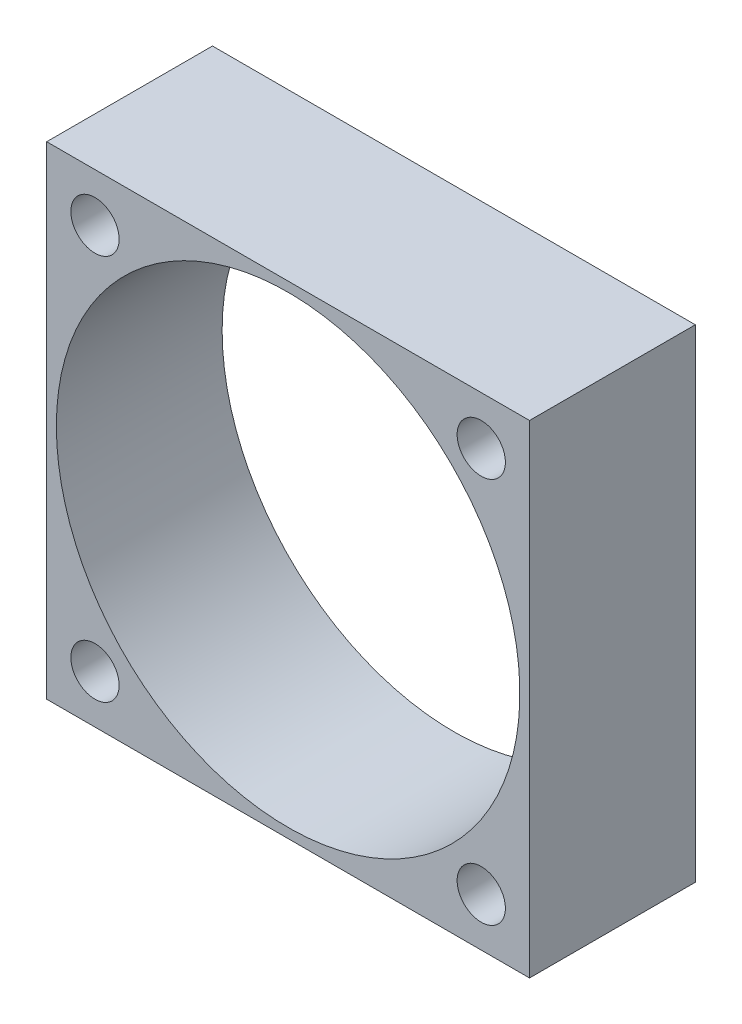
ISO-10303-21;
HEADER;
FILE_DESCRIPTION(('STEP AP214'),'2;1');
FILE_NAME('part.step','',(''),(''),'','','');
FILE_SCHEMA(('AUTOMOTIVE_DESIGN { 1 0 10303 214 1 1 1 1 }'));
ENDSEC;
DATA;
#1=APPLICATION_CONTEXT('core data for automotive mechanical design processes');
#2=APPLICATION_PROTOCOL_DEFINITION('international standard','automotive_design',2000,#1);
#3=PRODUCT_CONTEXT('',#1,'mechanical');
#4=PRODUCT('Part','Part','',(#3));
#5=PRODUCT_RELATED_PRODUCT_CATEGORY('part','',(#4));
#6=PRODUCT_DEFINITION_FORMATION('','',#4);
#7=PRODUCT_DEFINITION_CONTEXT('part definition',#1,'design');
#8=PRODUCT_DEFINITION('design','',#6,#7);
#9=PRODUCT_DEFINITION_SHAPE('','',#8);
#10=(LENGTH_UNIT() NAMED_UNIT(*) SI_UNIT(.MILLI.,.METRE.));
#11=(NAMED_UNIT(*) PLANE_ANGLE_UNIT() SI_UNIT($,.RADIAN.));
#12=(NAMED_UNIT(*) SI_UNIT($,.STERADIAN.) SOLID_ANGLE_UNIT());
#13=UNCERTAINTY_MEASURE_WITH_UNIT(LENGTH_MEASURE(1.E-05),#10,'distance_accuracy_value','');
#14=(GEOMETRIC_REPRESENTATION_CONTEXT(3) GLOBAL_UNCERTAINTY_ASSIGNED_CONTEXT((#13)) GLOBAL_UNIT_ASSIGNED_CONTEXT((#10,
#11,#12)) REPRESENTATION_CONTEXT('',''));
#15=CARTESIAN_POINT('',(0.,0.,0.));
#16=DIRECTION('',(0.,0.,1.));
#17=DIRECTION('',(1.,0.,0.));
#18=AXIS2_PLACEMENT_3D('',#15,#16,#17);
#19=CARTESIAN_POINT('',(0.,0.,10.3));
#20=DIRECTION('',(0.,0.,-1.));
#21=DIRECTION('',(-1.,0.,0.));
#22=AXIS2_PLACEMENT_3D('',#19,#20,#21);
#23=PLANE('',#22);
#24=DIRECTION('',(0.,1.,0.));
#25=VECTOR('',#24,1.);
#26=CARTESIAN_POINT('',(15.,-15.,10.3));
#27=LINE('',#26,#25);
#28=CARTESIAN_POINT('',(15.,-15.,10.3));
#29=VERTEX_POINT('',#28);
#30=CARTESIAN_POINT('',(15.,15.,10.3));
#31=VERTEX_POINT('',#30);
#32=EDGE_CURVE('E85',#29,#31,#27,.T.);
#33=ORIENTED_EDGE('',*,*,#32,.T.);
#34=DIRECTION('',(-1.,0.,0.));
#35=VECTOR('',#34,1.);
#36=CARTESIAN_POINT('',(-15.,15.,10.3));
#37=LINE('',#36,#35);
#38=CARTESIAN_POINT('',(-15.,15.,10.3));
#39=VERTEX_POINT('',#38);
#40=EDGE_CURVE('E80',#31,#39,#37,.T.);
#41=ORIENTED_EDGE('',*,*,#40,.T.);
#42=DIRECTION('',(0.,-1.,0.));
#43=VECTOR('',#42,1.);
#44=CARTESIAN_POINT('',(-15.,-15.,10.3));
#45=LINE('',#44,#43);
#46=CARTESIAN_POINT('',(-15.,-15.,10.3));
#47=VERTEX_POINT('',#46);
#48=EDGE_CURVE('E83',#39,#47,#45,.T.);
#49=ORIENTED_EDGE('',*,*,#48,.T.);
#50=DIRECTION('',(1.,0.,0.));
#51=VECTOR('',#50,1.);
#52=CARTESIAN_POINT('',(-15.,-15.,10.3));
#53=LINE('',#52,#51);
#54=EDGE_CURVE('E50',#47,#29,#53,.T.);
#55=ORIENTED_EDGE('',*,*,#54,.T.);
#56=EDGE_LOOP('',(#33,#41,#49,#55));
#57=FACE_BOUND('',#56,.T.);
#58=CARTESIAN_POINT('',(0.,0.,10.3));
#59=DIRECTION('',(0.,0.,1.));
#60=DIRECTION('',(1.,0.,0.));
#61=AXIS2_PLACEMENT_3D('',#58,#59,#60);
#62=CIRCLE('',#61,14.4);
#63=CARTESIAN_POINT('',(-14.4,0.,10.3));
#64=VERTEX_POINT('',#63);
#65=EDGE_CURVE('E100',#64,#64,#62,.T.);
#66=ORIENTED_EDGE('',*,*,#65,.F.);
#67=EDGE_LOOP('',(#66));
#68=FACE_BOUND('',#67,.T.);
#69=CARTESIAN_POINT('',(-12.,12.,10.3));
#70=DIRECTION('',(0.,0.,1.));
#71=DIRECTION('',(1.,0.,0.));
#72=AXIS2_PLACEMENT_3D('',#69,#70,#71);
#73=CIRCLE('',#72,1.5);
#74=CARTESIAN_POINT('',(-13.5,12.,10.3));
#75=VERTEX_POINT('',#74);
#76=EDGE_CURVE('E115',#75,#75,#73,.T.);
#77=ORIENTED_EDGE('',*,*,#76,.F.);
#78=EDGE_LOOP('',(#77));
#79=FACE_BOUND('',#78,.T.);
#80=CARTESIAN_POINT('',(12.,12.,10.3));
#81=DIRECTION('',(0.,0.,1.));
#82=DIRECTION('',(1.,0.,0.));
#83=AXIS2_PLACEMENT_3D('',#80,#81,#82);
#84=CIRCLE('',#83,1.5);
#85=CARTESIAN_POINT('',(10.5,12.,10.3));
#86=VERTEX_POINT('',#85);
#87=EDGE_CURVE('E121',#86,#86,#84,.T.);
#88=ORIENTED_EDGE('',*,*,#87,.F.);
#89=EDGE_LOOP('',(#88));
#90=FACE_BOUND('',#89,.T.);
#91=CARTESIAN_POINT('',(12.,-12.,10.3));
#92=DIRECTION('',(0.,0.,1.));
#93=DIRECTION('',(1.,0.,0.));
#94=AXIS2_PLACEMENT_3D('',#91,#92,#93);
#95=CIRCLE('',#94,1.5);
#96=CARTESIAN_POINT('',(10.5,-12.,10.3));
#97=VERTEX_POINT('',#96);
#98=EDGE_CURVE('E127',#97,#97,#95,.T.);
#99=ORIENTED_EDGE('',*,*,#98,.F.);
#100=EDGE_LOOP('',(#99));
#101=FACE_BOUND('',#100,.T.);
#102=CARTESIAN_POINT('',(-12.,-12.,10.3));
#103=DIRECTION('',(0.,0.,1.));
#104=DIRECTION('',(1.,0.,0.));
#105=AXIS2_PLACEMENT_3D('',#102,#103,#104);
#106=CIRCLE('',#105,1.5);
#107=CARTESIAN_POINT('',(-13.5,-12.,10.3));
#108=VERTEX_POINT('',#107);
#109=EDGE_CURVE('E133',#108,#108,#106,.T.);
#110=ORIENTED_EDGE('',*,*,#109,.F.);
#111=EDGE_LOOP('',(#110));
#112=FACE_BOUND('',#111,.T.);
#113=ADVANCED_FACE('F33',(#57,#68,#79,#90,#101,#112),#23,.F.);
#114=CARTESIAN_POINT('',(0.,0.,0.));
#115=DIRECTION('',(0.,0.,-1.));
#116=DIRECTION('',(-1.,0.,0.));
#117=AXIS2_PLACEMENT_3D('',#114,#115,#116);
#118=PLANE('',#117);
#119=CARTESIAN_POINT('',(12.,-12.,0.));
#120=DIRECTION('',(0.,0.,1.));
#121=DIRECTION('',(1.,0.,0.));
#122=AXIS2_PLACEMENT_3D('',#119,#120,#121);
#123=CIRCLE('',#122,1.5);
#124=CARTESIAN_POINT('',(10.5,-12.,0.));
#125=VERTEX_POINT('',#124);
#126=EDGE_CURVE('E130',#125,#125,#123,.T.);
#127=ORIENTED_EDGE('',*,*,#126,.T.);
#128=EDGE_LOOP('',(#127));
#129=FACE_BOUND('',#128,.T.);
#130=CARTESIAN_POINT('',(-12.,12.,0.));
#131=DIRECTION('',(0.,0.,1.));
#132=DIRECTION('',(1.,0.,0.));
#133=AXIS2_PLACEMENT_3D('',#130,#131,#132);
#134=CIRCLE('',#133,1.5);
#135=CARTESIAN_POINT('',(-13.5,12.,0.));
#136=VERTEX_POINT('',#135);
#137=EDGE_CURVE('E118',#136,#136,#134,.T.);
#138=ORIENTED_EDGE('',*,*,#137,.T.);
#139=EDGE_LOOP('',(#138));
#140=FACE_BOUND('',#139,.T.);
#141=DIRECTION('',(0.,1.,0.));
#142=VECTOR('',#141,1.);
#143=CARTESIAN_POINT('',(15.,-15.,0.));
#144=LINE('',#143,#142);
#145=CARTESIAN_POINT('',(15.,-15.,0.));
#146=VERTEX_POINT('',#145);
#147=CARTESIAN_POINT('',(15.,15.,0.));
#148=VERTEX_POINT('',#147);
#149=EDGE_CURVE('E97',#146,#148,#144,.T.);
#150=ORIENTED_EDGE('',*,*,#149,.F.);
#151=DIRECTION('',(1.,0.,0.));
#152=VECTOR('',#151,1.);
#153=CARTESIAN_POINT('',(-15.,-15.,0.));
#154=LINE('',#153,#152);
#155=CARTESIAN_POINT('',(-15.,-15.,0.));
#156=VERTEX_POINT('',#155);
#157=EDGE_CURVE('E73',#156,#146,#154,.T.);
#158=ORIENTED_EDGE('',*,*,#157,.F.);
#159=DIRECTION('',(0.,-1.,0.));
#160=VECTOR('',#159,1.);
#161=CARTESIAN_POINT('',(-15.,-15.,0.));
#162=LINE('',#161,#160);
#163=CARTESIAN_POINT('',(-15.,15.,0.));
#164=VERTEX_POINT('',#163);
#165=EDGE_CURVE('E67',#164,#156,#162,.T.);
#166=ORIENTED_EDGE('',*,*,#165,.F.);
#167=DIRECTION('',(-1.,0.,0.));
#168=VECTOR('',#167,1.);
#169=CARTESIAN_POINT('',(-15.,15.,0.));
#170=LINE('',#169,#168);
#171=EDGE_CURVE('E89',#148,#164,#170,.T.);
#172=ORIENTED_EDGE('',*,*,#171,.F.);
#173=EDGE_LOOP('',(#150,#158,#166,#172));
#174=FACE_BOUND('',#173,.T.);
#175=CARTESIAN_POINT('',(0.,0.,0.));
#176=DIRECTION('',(0.,0.,1.));
#177=DIRECTION('',(1.,0.,0.));
#178=AXIS2_PLACEMENT_3D('',#175,#176,#177);
#179=CIRCLE('',#178,14.4);
#180=CARTESIAN_POINT('',(-14.4,0.,0.));
#181=VERTEX_POINT('',#180);
#182=EDGE_CURVE('E112',#181,#181,#179,.T.);
#183=ORIENTED_EDGE('',*,*,#182,.T.);
#184=EDGE_LOOP('',(#183));
#185=FACE_BOUND('',#184,.T.);
#186=CARTESIAN_POINT('',(12.,12.,0.));
#187=DIRECTION('',(0.,0.,1.));
#188=DIRECTION('',(1.,0.,0.));
#189=AXIS2_PLACEMENT_3D('',#186,#187,#188);
#190=CIRCLE('',#189,1.5);
#191=CARTESIAN_POINT('',(10.5,12.,0.));
#192=VERTEX_POINT('',#191);
#193=EDGE_CURVE('E124',#192,#192,#190,.T.);
#194=ORIENTED_EDGE('',*,*,#193,.T.);
#195=EDGE_LOOP('',(#194));
#196=FACE_BOUND('',#195,.T.);
#197=CARTESIAN_POINT('',(-12.,-12.,0.));
#198=DIRECTION('',(0.,0.,1.));
#199=DIRECTION('',(1.,0.,0.));
#200=AXIS2_PLACEMENT_3D('',#197,#198,#199);
#201=CIRCLE('',#200,1.5);
#202=CARTESIAN_POINT('',(-13.5,-12.,0.));
#203=VERTEX_POINT('',#202);
#204=EDGE_CURVE('E136',#203,#203,#201,.T.);
#205=ORIENTED_EDGE('',*,*,#204,.T.);
#206=EDGE_LOOP('',(#205));
#207=FACE_BOUND('',#206,.T.);
#208=ADVANCED_FACE('F108',(#129,#140,#174,#185,#196,#207),#118,.T.);
#209=CARTESIAN_POINT('',(15.,-15.,10.3));
#210=DIRECTION('',(-1.,0.,0.));
#211=DIRECTION('',(0.,0.,1.));
#212=AXIS2_PLACEMENT_3D('',#209,#210,#211);
#213=PLANE('',#212);
#214=ORIENTED_EDGE('',*,*,#149,.T.);
#215=DIRECTION('',(0.,0.,-1.));
#216=VECTOR('',#215,1.);
#217=CARTESIAN_POINT('',(15.,15.,10.3));
#218=LINE('',#217,#216);
#219=EDGE_CURVE('E11',#31,#148,#218,.T.);
#220=ORIENTED_EDGE('',*,*,#219,.F.);
#221=ORIENTED_EDGE('',*,*,#32,.F.);
#222=DIRECTION('',(0.,0.,-1.));
#223=VECTOR('',#222,1.);
#224=CARTESIAN_POINT('',(15.,-15.,10.3));
#225=LINE('',#224,#223);
#226=EDGE_CURVE('E93',#29,#146,#225,.T.);
#227=ORIENTED_EDGE('',*,*,#226,.T.);
#228=EDGE_LOOP('',(#214,#220,#221,#227));
#229=FACE_BOUND('',#228,.T.);
#230=ADVANCED_FACE('F35',(#229),#213,.F.);
#231=CARTESIAN_POINT('',(-15.,15.,10.3));
#232=DIRECTION('',(0.,-1.,0.));
#233=DIRECTION('',(0.,0.,-1.));
#234=AXIS2_PLACEMENT_3D('',#231,#232,#233);
#235=PLANE('',#234);
#236=ORIENTED_EDGE('',*,*,#171,.T.);
#237=DIRECTION('',(0.,0.,-1.));
#238=VECTOR('',#237,1.);
#239=CARTESIAN_POINT('',(-15.,15.,10.3));
#240=LINE('',#239,#238);
#241=EDGE_CURVE('E42',#39,#164,#240,.T.);
#242=ORIENTED_EDGE('',*,*,#241,.F.);
#243=ORIENTED_EDGE('',*,*,#40,.F.);
#244=ORIENTED_EDGE('',*,*,#219,.T.);
#245=EDGE_LOOP('',(#236,#242,#243,#244));
#246=FACE_BOUND('',#245,.T.);
#247=ADVANCED_FACE('F88',(#246),#235,.F.);
#248=CARTESIAN_POINT('',(-15.,-15.,10.3));
#249=DIRECTION('',(1.,0.,0.));
#250=DIRECTION('',(0.,0.,-1.));
#251=AXIS2_PLACEMENT_3D('',#248,#249,#250);
#252=PLANE('',#251);
#253=ORIENTED_EDGE('',*,*,#165,.T.);
#254=DIRECTION('',(0.,0.,-1.));
#255=VECTOR('',#254,1.);
#256=CARTESIAN_POINT('',(-15.,-15.,10.3));
#257=LINE('',#256,#255);
#258=EDGE_CURVE('E90',#47,#156,#257,.T.);
#259=ORIENTED_EDGE('',*,*,#258,.F.);
#260=ORIENTED_EDGE('',*,*,#48,.F.);
#261=ORIENTED_EDGE('',*,*,#241,.T.);
#262=EDGE_LOOP('',(#253,#259,#260,#261));
#263=FACE_BOUND('',#262,.T.);
#264=ADVANCED_FACE('F91',(#263),#252,.F.);
#265=CARTESIAN_POINT('',(-15.,-15.,10.3));
#266=DIRECTION('',(0.,1.,0.));
#267=DIRECTION('',(0.,0.,1.));
#268=AXIS2_PLACEMENT_3D('',#265,#266,#267);
#269=PLANE('',#268);
#270=ORIENTED_EDGE('',*,*,#157,.T.);
#271=ORIENTED_EDGE('',*,*,#226,.F.);
#272=ORIENTED_EDGE('',*,*,#54,.F.);
#273=ORIENTED_EDGE('',*,*,#258,.T.);
#274=EDGE_LOOP('',(#270,#271,#272,#273));
#275=FACE_BOUND('',#274,.T.);
#276=ADVANCED_FACE('F105',(#275),#269,.F.);
#277=CARTESIAN_POINT('',(0.,0.,10.3));
#278=DIRECTION('',(0.,0.,-1.));
#279=DIRECTION('',(-1.,0.,0.));
#280=AXIS2_PLACEMENT_3D('',#277,#278,#279);
#281=CYLINDRICAL_SURFACE('',#280,14.4);
#282=CARTESIAN_POINT('',(-14.4,0.,10.3));
#283=CARTESIAN_POINT('',(-14.4,0.,10.1927083333333));
#284=CARTESIAN_POINT('',(-14.4,0.,10.0854166666667));
#285=CARTESIAN_POINT('',(-14.4,0.,9.87083333333333));
#286=CARTESIAN_POINT('',(-14.4,0.,9.76354166666667));
#287=CARTESIAN_POINT('',(-14.4,0.,9.54895833333333));
#288=CARTESIAN_POINT('',(-14.4,0.,9.44166666666667));
#289=CARTESIAN_POINT('',(-14.4,0.,9.22708333333333));
#290=CARTESIAN_POINT('',(-14.4,0.,9.11979166666667));
#291=CARTESIAN_POINT('',(-14.4,0.,8.90520833333333));
#292=CARTESIAN_POINT('',(-14.4,0.,8.79791666666667));
#293=CARTESIAN_POINT('',(-14.4,0.,8.58333333333333));
#294=CARTESIAN_POINT('',(-14.4,0.,8.47604166666667));
#295=CARTESIAN_POINT('',(-14.4,0.,8.26145833333333));
#296=CARTESIAN_POINT('',(-14.4,0.,8.15416666666667));
#297=CARTESIAN_POINT('',(-14.4,0.,7.93958333333333));
#298=CARTESIAN_POINT('',(-14.4,0.,7.83229166666667));
#299=CARTESIAN_POINT('',(-14.4,0.,7.61770833333333));
#300=CARTESIAN_POINT('',(-14.4,0.,7.51041666666667));
#301=CARTESIAN_POINT('',(-14.4,0.,7.29583333333333));
#302=CARTESIAN_POINT('',(-14.4,0.,7.18854166666667));
#303=CARTESIAN_POINT('',(-14.4,0.,6.97395833333333));
#304=CARTESIAN_POINT('',(-14.4,0.,6.86666666666667));
#305=CARTESIAN_POINT('',(-14.4,0.,6.65208333333333));
#306=CARTESIAN_POINT('',(-14.4,0.,6.54479166666667));
#307=CARTESIAN_POINT('',(-14.4,0.,6.33020833333333));
#308=CARTESIAN_POINT('',(-14.4,0.,6.22291666666667));
#309=CARTESIAN_POINT('',(-14.4,0.,6.00833333333333));
#310=CARTESIAN_POINT('',(-14.4,0.,5.90104166666667));
#311=CARTESIAN_POINT('',(-14.4,0.,5.68645833333333));
#312=CARTESIAN_POINT('',(-14.4,0.,5.57916666666667));
#313=CARTESIAN_POINT('',(-14.4,0.,5.36458333333333));
#314=CARTESIAN_POINT('',(-14.4,0.,5.25729166666667));
#315=CARTESIAN_POINT('',(-14.4,0.,5.04270833333333));
#316=CARTESIAN_POINT('',(-14.4,0.,4.93541666666667));
#317=CARTESIAN_POINT('',(-14.4,0.,4.72083333333333));
#318=CARTESIAN_POINT('',(-14.4,0.,4.61354166666667));
#319=CARTESIAN_POINT('',(-14.4,0.,4.39895833333333));
#320=CARTESIAN_POINT('',(-14.4,0.,4.29166666666667));
#321=CARTESIAN_POINT('',(-14.4,0.,4.07708333333333));
#322=CARTESIAN_POINT('',(-14.4,0.,3.96979166666667));
#323=CARTESIAN_POINT('',(-14.4,0.,3.75520833333333));
#324=CARTESIAN_POINT('',(-14.4,0.,3.64791666666667));
#325=CARTESIAN_POINT('',(-14.4,0.,3.43333333333333));
#326=CARTESIAN_POINT('',(-14.4,0.,3.32604166666667));
#327=CARTESIAN_POINT('',(-14.4,0.,3.11145833333333));
#328=CARTESIAN_POINT('',(-14.4,0.,3.00416666666667));
#329=CARTESIAN_POINT('',(-14.4,0.,2.78958333333333));
#330=CARTESIAN_POINT('',(-14.4,0.,2.68229166666667));
#331=CARTESIAN_POINT('',(-14.4,0.,2.46770833333333));
#332=CARTESIAN_POINT('',(-14.4,0.,2.36041666666667));
#333=CARTESIAN_POINT('',(-14.4,0.,2.14583333333333));
#334=CARTESIAN_POINT('',(-14.4,0.,2.03854166666667));
#335=CARTESIAN_POINT('',(-14.4,0.,1.82395833333333));
#336=CARTESIAN_POINT('',(-14.4,0.,1.71666666666667));
#337=CARTESIAN_POINT('',(-14.4,0.,1.50208333333333));
#338=CARTESIAN_POINT('',(-14.4,0.,1.39479166666667));
#339=CARTESIAN_POINT('',(-14.4,0.,1.18020833333333));
#340=CARTESIAN_POINT('',(-14.4,0.,1.07291666666666));
#341=CARTESIAN_POINT('',(-14.4,0.,0.858333333333331));
#342=CARTESIAN_POINT('',(-14.4,0.,0.751041666666665));
#343=CARTESIAN_POINT('',(-14.4,0.,0.536458333333331));
#344=CARTESIAN_POINT('',(-14.4,0.,0.429166666666664));
#345=CARTESIAN_POINT('',(-14.4,0.,0.214583333333331));
#346=CARTESIAN_POINT('',(-14.4,0.,0.107291666666665));
#347=CARTESIAN_POINT('',(-14.4,0.,0.));
#348=B_SPLINE_CURVE_WITH_KNOTS('',3,(#282,#283,#284,#285,#286,#287,#288,#289,#290,#291,#292,
#293,#294,#295,#296,#297,#298,#299,#300,#301,#302,#303,#304,#305,#306,#307,#308,#309,#310,#311,
#312,#313,#314,#315,#316,#317,#318,#319,#320,#321,#322,#323,#324,#325,#326,#327,#328,#329,#330,
#331,#332,#333,#334,#335,#336,#337,#338,#339,#340,#341,#342,#343,#344,#345,#346,#347),
.UNSPECIFIED.,.F.,.F.,(4,2,2,2,2,2,2,2,2,2,2,2,2,2,2,2,2,2,2,2,2,2,2,2,2,2,2,2,2,2,2,2,4),(0.,
0.321874999999999,0.643749999999998,0.965625,1.2875,1.609375,1.93125,2.253125,2.575,2.896875,
3.21875,3.540625,3.8625,4.184375,4.50625,4.828125,5.15,5.471875,5.79375,6.115625,6.4375,
6.759375,7.08125,7.403125,7.725,8.046875,8.36875,8.690625,9.0125,9.334375,9.65625,9.978125,
10.3),.UNSPECIFIED.);
#349=EDGE_CURVE('BSEAM153',#64,#181,#348,.T.);
#350=ORIENTED_EDGE('',*,*,#65,.T.);
#351=ORIENTED_EDGE('',*,*,#182,.F.);
#352=ORIENTED_EDGE('',*,*,#349,.T.);
#353=ORIENTED_EDGE('',*,*,#349,.F.);
#354=EDGE_LOOP('',(#350,#352,#351,#353));
#355=FACE_BOUND('',#354,.T.);
#356=ADVANCED_FACE('F153',(#355),#281,.F.);
#357=CARTESIAN_POINT('',(-12.,12.,10.3));
#358=DIRECTION('',(0.,0.,-1.));
#359=DIRECTION('',(-1.,0.,0.));
#360=AXIS2_PLACEMENT_3D('',#357,#358,#359);
#361=CYLINDRICAL_SURFACE('',#360,1.5);
#362=CARTESIAN_POINT('',(-13.5,12.,10.3));
#363=CARTESIAN_POINT('',(-13.5,12.,10.1927083333333));
#364=CARTESIAN_POINT('',(-13.5,12.,10.0854166666667));
#365=CARTESIAN_POINT('',(-13.5,12.,9.87083333333333));
#366=CARTESIAN_POINT('',(-13.5,12.,9.76354166666667));
#367=CARTESIAN_POINT('',(-13.5,12.,9.54895833333333));
#368=CARTESIAN_POINT('',(-13.5,12.,9.44166666666667));
#369=CARTESIAN_POINT('',(-13.5,12.,9.22708333333333));
#370=CARTESIAN_POINT('',(-13.5,12.,9.11979166666667));
#371=CARTESIAN_POINT('',(-13.5,12.,8.90520833333333));
#372=CARTESIAN_POINT('',(-13.5,12.,8.79791666666667));
#373=CARTESIAN_POINT('',(-13.5,12.,8.58333333333333));
#374=CARTESIAN_POINT('',(-13.5,12.,8.47604166666667));
#375=CARTESIAN_POINT('',(-13.5,12.,8.26145833333333));
#376=CARTESIAN_POINT('',(-13.5,12.,8.15416666666667));
#377=CARTESIAN_POINT('',(-13.5,12.,7.93958333333333));
#378=CARTESIAN_POINT('',(-13.5,12.,7.83229166666667));
#379=CARTESIAN_POINT('',(-13.5,12.,7.61770833333333));
#380=CARTESIAN_POINT('',(-13.5,12.,7.51041666666667));
#381=CARTESIAN_POINT('',(-13.5,12.,7.29583333333333));
#382=CARTESIAN_POINT('',(-13.5,12.,7.18854166666667));
#383=CARTESIAN_POINT('',(-13.5,12.,6.97395833333333));
#384=CARTESIAN_POINT('',(-13.5,12.,6.86666666666667));
#385=CARTESIAN_POINT('',(-13.5,12.,6.65208333333333));
#386=CARTESIAN_POINT('',(-13.5,12.,6.54479166666667));
#387=CARTESIAN_POINT('',(-13.5,12.,6.33020833333333));
#388=CARTESIAN_POINT('',(-13.5,12.,6.22291666666667));
#389=CARTESIAN_POINT('',(-13.5,12.,6.00833333333333));
#390=CARTESIAN_POINT('',(-13.5,12.,5.90104166666667));
#391=CARTESIAN_POINT('',(-13.5,12.,5.68645833333333));
#392=CARTESIAN_POINT('',(-13.5,12.,5.57916666666667));
#393=CARTESIAN_POINT('',(-13.5,12.,5.36458333333333));
#394=CARTESIAN_POINT('',(-13.5,12.,5.25729166666667));
#395=CARTESIAN_POINT('',(-13.5,12.,5.04270833333333));
#396=CARTESIAN_POINT('',(-13.5,12.,4.93541666666667));
#397=CARTESIAN_POINT('',(-13.5,12.,4.72083333333333));
#398=CARTESIAN_POINT('',(-13.5,12.,4.61354166666667));
#399=CARTESIAN_POINT('',(-13.5,12.,4.39895833333333));
#400=CARTESIAN_POINT('',(-13.5,12.,4.29166666666667));
#401=CARTESIAN_POINT('',(-13.5,12.,4.07708333333333));
#402=CARTESIAN_POINT('',(-13.5,12.,3.96979166666667));
#403=CARTESIAN_POINT('',(-13.5,12.,3.75520833333333));
#404=CARTESIAN_POINT('',(-13.5,12.,3.64791666666667));
#405=CARTESIAN_POINT('',(-13.5,12.,3.43333333333333));
#406=CARTESIAN_POINT('',(-13.5,12.,3.32604166666667));
#407=CARTESIAN_POINT('',(-13.5,12.,3.11145833333333));
#408=CARTESIAN_POINT('',(-13.5,12.,3.00416666666667));
#409=CARTESIAN_POINT('',(-13.5,12.,2.78958333333333));
#410=CARTESIAN_POINT('',(-13.5,12.,2.68229166666667));
#411=CARTESIAN_POINT('',(-13.5,12.,2.46770833333333));
#412=CARTESIAN_POINT('',(-13.5,12.,2.36041666666667));
#413=CARTESIAN_POINT('',(-13.5,12.,2.14583333333333));
#414=CARTESIAN_POINT('',(-13.5,12.,2.03854166666667));
#415=CARTESIAN_POINT('',(-13.5,12.,1.82395833333333));
#416=CARTESIAN_POINT('',(-13.5,12.,1.71666666666667));
#417=CARTESIAN_POINT('',(-13.5,12.,1.50208333333333));
#418=CARTESIAN_POINT('',(-13.5,12.,1.39479166666667));
#419=CARTESIAN_POINT('',(-13.5,12.,1.18020833333333));
#420=CARTESIAN_POINT('',(-13.5,12.,1.07291666666666));
#421=CARTESIAN_POINT('',(-13.5,12.,0.858333333333331));
#422=CARTESIAN_POINT('',(-13.5,12.,0.751041666666665));
#423=CARTESIAN_POINT('',(-13.5,12.,0.536458333333331));
#424=CARTESIAN_POINT('',(-13.5,12.,0.429166666666664));
#425=CARTESIAN_POINT('',(-13.5,12.,0.214583333333331));
#426=CARTESIAN_POINT('',(-13.5,12.,0.107291666666665));
#427=CARTESIAN_POINT('',(-13.5,12.,0.));
#428=B_SPLINE_CURVE_WITH_KNOTS('',3,(#362,#363,#364,#365,#366,#367,#368,#369,#370,#371,#372,
#373,#374,#375,#376,#377,#378,#379,#380,#381,#382,#383,#384,#385,#386,#387,#388,#389,#390,#391,
#392,#393,#394,#395,#396,#397,#398,#399,#400,#401,#402,#403,#404,#405,#406,#407,#408,#409,#410,
#411,#412,#413,#414,#415,#416,#417,#418,#419,#420,#421,#422,#423,#424,#425,#426,#427),
.UNSPECIFIED.,.F.,.F.,(4,2,2,2,2,2,2,2,2,2,2,2,2,2,2,2,2,2,2,2,2,2,2,2,2,2,2,2,2,2,2,2,4),(0.,
0.321874999999999,0.643749999999998,0.965625,1.2875,1.609375,1.93125,2.253125,2.575,2.896875,
3.21875,3.540625,3.8625,4.184375,4.50625,4.828125,5.15,5.471875,5.79375,6.115625,6.4375,
6.759375,7.08125,7.403125,7.725,8.046875,8.36875,8.690625,9.0125,9.334375,9.65625,9.978125,
10.3),.UNSPECIFIED.);
#429=EDGE_CURVE('BSEAM199',#75,#136,#428,.T.);
#430=ORIENTED_EDGE('',*,*,#76,.T.);
#431=ORIENTED_EDGE('',*,*,#137,.F.);
#432=ORIENTED_EDGE('',*,*,#429,.T.);
#433=ORIENTED_EDGE('',*,*,#429,.F.);
#434=EDGE_LOOP('',(#430,#432,#431,#433));
#435=FACE_BOUND('',#434,.T.);
#436=ADVANCED_FACE('F199',(#435),#361,.F.);
#437=CARTESIAN_POINT('',(12.,12.,10.3));
#438=DIRECTION('',(0.,0.,-1.));
#439=DIRECTION('',(-1.,0.,0.));
#440=AXIS2_PLACEMENT_3D('',#437,#438,#439);
#441=CYLINDRICAL_SURFACE('',#440,1.5);
#442=CARTESIAN_POINT('',(10.5,12.,10.3));
#443=CARTESIAN_POINT('',(10.5,12.,10.1927083333333));
#444=CARTESIAN_POINT('',(10.5,12.,10.0854166666667));
#445=CARTESIAN_POINT('',(10.5,12.,9.87083333333333));
#446=CARTESIAN_POINT('',(10.5,12.,9.76354166666667));
#447=CARTESIAN_POINT('',(10.5,12.,9.54895833333333));
#448=CARTESIAN_POINT('',(10.5,12.,9.44166666666667));
#449=CARTESIAN_POINT('',(10.5,12.,9.22708333333333));
#450=CARTESIAN_POINT('',(10.5,12.,9.11979166666667));
#451=CARTESIAN_POINT('',(10.5,12.,8.90520833333333));
#452=CARTESIAN_POINT('',(10.5,12.,8.79791666666667));
#453=CARTESIAN_POINT('',(10.5,12.,8.58333333333333));
#454=CARTESIAN_POINT('',(10.5,12.,8.47604166666667));
#455=CARTESIAN_POINT('',(10.5,12.,8.26145833333333));
#456=CARTESIAN_POINT('',(10.5,12.,8.15416666666667));
#457=CARTESIAN_POINT('',(10.5,12.,7.93958333333333));
#458=CARTESIAN_POINT('',(10.5,12.,7.83229166666667));
#459=CARTESIAN_POINT('',(10.5,12.,7.61770833333333));
#460=CARTESIAN_POINT('',(10.5,12.,7.51041666666667));
#461=CARTESIAN_POINT('',(10.5,12.,7.29583333333333));
#462=CARTESIAN_POINT('',(10.5,12.,7.18854166666667));
#463=CARTESIAN_POINT('',(10.5,12.,6.97395833333333));
#464=CARTESIAN_POINT('',(10.5,12.,6.86666666666667));
#465=CARTESIAN_POINT('',(10.5,12.,6.65208333333333));
#466=CARTESIAN_POINT('',(10.5,12.,6.54479166666667));
#467=CARTESIAN_POINT('',(10.5,12.,6.33020833333333));
#468=CARTESIAN_POINT('',(10.5,12.,6.22291666666667));
#469=CARTESIAN_POINT('',(10.5,12.,6.00833333333333));
#470=CARTESIAN_POINT('',(10.5,12.,5.90104166666667));
#471=CARTESIAN_POINT('',(10.5,12.,5.68645833333333));
#472=CARTESIAN_POINT('',(10.5,12.,5.57916666666667));
#473=CARTESIAN_POINT('',(10.5,12.,5.36458333333333));
#474=CARTESIAN_POINT('',(10.5,12.,5.25729166666667));
#475=CARTESIAN_POINT('',(10.5,12.,5.04270833333333));
#476=CARTESIAN_POINT('',(10.5,12.,4.93541666666667));
#477=CARTESIAN_POINT('',(10.5,12.,4.72083333333333));
#478=CARTESIAN_POINT('',(10.5,12.,4.61354166666667));
#479=CARTESIAN_POINT('',(10.5,12.,4.39895833333333));
#480=CARTESIAN_POINT('',(10.5,12.,4.29166666666667));
#481=CARTESIAN_POINT('',(10.5,12.,4.07708333333333));
#482=CARTESIAN_POINT('',(10.5,12.,3.96979166666667));
#483=CARTESIAN_POINT('',(10.5,12.,3.75520833333333));
#484=CARTESIAN_POINT('',(10.5,12.,3.64791666666667));
#485=CARTESIAN_POINT('',(10.5,12.,3.43333333333333));
#486=CARTESIAN_POINT('',(10.5,12.,3.32604166666667));
#487=CARTESIAN_POINT('',(10.5,12.,3.11145833333333));
#488=CARTESIAN_POINT('',(10.5,12.,3.00416666666667));
#489=CARTESIAN_POINT('',(10.5,12.,2.78958333333333));
#490=CARTESIAN_POINT('',(10.5,12.,2.68229166666667));
#491=CARTESIAN_POINT('',(10.5,12.,2.46770833333333));
#492=CARTESIAN_POINT('',(10.5,12.,2.36041666666667));
#493=CARTESIAN_POINT('',(10.5,12.,2.14583333333333));
#494=CARTESIAN_POINT('',(10.5,12.,2.03854166666667));
#495=CARTESIAN_POINT('',(10.5,12.,1.82395833333333));
#496=CARTESIAN_POINT('',(10.5,12.,1.71666666666667));
#497=CARTESIAN_POINT('',(10.5,12.,1.50208333333333));
#498=CARTESIAN_POINT('',(10.5,12.,1.39479166666667));
#499=CARTESIAN_POINT('',(10.5,12.,1.18020833333333));
#500=CARTESIAN_POINT('',(10.5,12.,1.07291666666666));
#501=CARTESIAN_POINT('',(10.5,12.,0.858333333333331));
#502=CARTESIAN_POINT('',(10.5,12.,0.751041666666665));
#503=CARTESIAN_POINT('',(10.5,12.,0.536458333333331));
#504=CARTESIAN_POINT('',(10.5,12.,0.429166666666664));
#505=CARTESIAN_POINT('',(10.5,12.,0.214583333333331));
#506=CARTESIAN_POINT('',(10.5,12.,0.107291666666665));
#507=CARTESIAN_POINT('',(10.5,12.,0.));
#508=B_SPLINE_CURVE_WITH_KNOTS('',3,(#442,#443,#444,#445,#446,#447,#448,#449,#450,#451,#452,
#453,#454,#455,#456,#457,#458,#459,#460,#461,#462,#463,#464,#465,#466,#467,#468,#469,#470,#471,
#472,#473,#474,#475,#476,#477,#478,#479,#480,#481,#482,#483,#484,#485,#486,#487,#488,#489,#490,
#491,#492,#493,#494,#495,#496,#497,#498,#499,#500,#501,#502,#503,#504,#505,#506,#507),
.UNSPECIFIED.,.F.,.F.,(4,2,2,2,2,2,2,2,2,2,2,2,2,2,2,2,2,2,2,2,2,2,2,2,2,2,2,2,2,2,2,2,4),(0.,
0.321874999999999,0.643749999999998,0.965625,1.2875,1.609375,1.93125,2.253125,2.575,2.896875,
3.21875,3.540625,3.8625,4.184375,4.50625,4.828125,5.15,5.471875,5.79375,6.115625,6.4375,
6.759375,7.08125,7.403125,7.725,8.046875,8.36875,8.690625,9.0125,9.334375,9.65625,9.978125,
10.3),.UNSPECIFIED.);
#509=EDGE_CURVE('BSEAM207',#86,#192,#508,.T.);
#510=ORIENTED_EDGE('',*,*,#87,.T.);
#511=ORIENTED_EDGE('',*,*,#193,.F.);
#512=ORIENTED_EDGE('',*,*,#509,.T.);
#513=ORIENTED_EDGE('',*,*,#509,.F.);
#514=EDGE_LOOP('',(#510,#512,#511,#513));
#515=FACE_BOUND('',#514,.T.);
#516=ADVANCED_FACE('F207',(#515),#441,.F.);
#517=CARTESIAN_POINT('',(12.,-12.,10.3));
#518=DIRECTION('',(0.,0.,-1.));
#519=DIRECTION('',(-1.,0.,0.));
#520=AXIS2_PLACEMENT_3D('',#517,#518,#519);
#521=CYLINDRICAL_SURFACE('',#520,1.5);
#522=CARTESIAN_POINT('',(10.5,-12.,10.3));
#523=CARTESIAN_POINT('',(10.5,-12.,10.1927083333333));
#524=CARTESIAN_POINT('',(10.5,-12.,10.0854166666667));
#525=CARTESIAN_POINT('',(10.5,-12.,9.87083333333333));
#526=CARTESIAN_POINT('',(10.5,-12.,9.76354166666667));
#527=CARTESIAN_POINT('',(10.5,-12.,9.54895833333333));
#528=CARTESIAN_POINT('',(10.5,-12.,9.44166666666667));
#529=CARTESIAN_POINT('',(10.5,-12.,9.22708333333333));
#530=CARTESIAN_POINT('',(10.5,-12.,9.11979166666667));
#531=CARTESIAN_POINT('',(10.5,-12.,8.90520833333333));
#532=CARTESIAN_POINT('',(10.5,-12.,8.79791666666667));
#533=CARTESIAN_POINT('',(10.5,-12.,8.58333333333333));
#534=CARTESIAN_POINT('',(10.5,-12.,8.47604166666667));
#535=CARTESIAN_POINT('',(10.5,-12.,8.26145833333333));
#536=CARTESIAN_POINT('',(10.5,-12.,8.15416666666667));
#537=CARTESIAN_POINT('',(10.5,-12.,7.93958333333333));
#538=CARTESIAN_POINT('',(10.5,-12.,7.83229166666667));
#539=CARTESIAN_POINT('',(10.5,-12.,7.61770833333333));
#540=CARTESIAN_POINT('',(10.5,-12.,7.51041666666667));
#541=CARTESIAN_POINT('',(10.5,-12.,7.29583333333333));
#542=CARTESIAN_POINT('',(10.5,-12.,7.18854166666667));
#543=CARTESIAN_POINT('',(10.5,-12.,6.97395833333333));
#544=CARTESIAN_POINT('',(10.5,-12.,6.86666666666667));
#545=CARTESIAN_POINT('',(10.5,-12.,6.65208333333333));
#546=CARTESIAN_POINT('',(10.5,-12.,6.54479166666667));
#547=CARTESIAN_POINT('',(10.5,-12.,6.33020833333333));
#548=CARTESIAN_POINT('',(10.5,-12.,6.22291666666667));
#549=CARTESIAN_POINT('',(10.5,-12.,6.00833333333333));
#550=CARTESIAN_POINT('',(10.5,-12.,5.90104166666667));
#551=CARTESIAN_POINT('',(10.5,-12.,5.68645833333333));
#552=CARTESIAN_POINT('',(10.5,-12.,5.57916666666667));
#553=CARTESIAN_POINT('',(10.5,-12.,5.36458333333333));
#554=CARTESIAN_POINT('',(10.5,-12.,5.25729166666667));
#555=CARTESIAN_POINT('',(10.5,-12.,5.04270833333333));
#556=CARTESIAN_POINT('',(10.5,-12.,4.93541666666667));
#557=CARTESIAN_POINT('',(10.5,-12.,4.72083333333333));
#558=CARTESIAN_POINT('',(10.5,-12.,4.61354166666667));
#559=CARTESIAN_POINT('',(10.5,-12.,4.39895833333333));
#560=CARTESIAN_POINT('',(10.5,-12.,4.29166666666667));
#561=CARTESIAN_POINT('',(10.5,-12.,4.07708333333333));
#562=CARTESIAN_POINT('',(10.5,-12.,3.96979166666667));
#563=CARTESIAN_POINT('',(10.5,-12.,3.75520833333333));
#564=CARTESIAN_POINT('',(10.5,-12.,3.64791666666667));
#565=CARTESIAN_POINT('',(10.5,-12.,3.43333333333333));
#566=CARTESIAN_POINT('',(10.5,-12.,3.32604166666667));
#567=CARTESIAN_POINT('',(10.5,-12.,3.11145833333333));
#568=CARTESIAN_POINT('',(10.5,-12.,3.00416666666667));
#569=CARTESIAN_POINT('',(10.5,-12.,2.78958333333333));
#570=CARTESIAN_POINT('',(10.5,-12.,2.68229166666667));
#571=CARTESIAN_POINT('',(10.5,-12.,2.46770833333333));
#572=CARTESIAN_POINT('',(10.5,-12.,2.36041666666667));
#573=CARTESIAN_POINT('',(10.5,-12.,2.14583333333333));
#574=CARTESIAN_POINT('',(10.5,-12.,2.03854166666667));
#575=CARTESIAN_POINT('',(10.5,-12.,1.82395833333333));
#576=CARTESIAN_POINT('',(10.5,-12.,1.71666666666667));
#577=CARTESIAN_POINT('',(10.5,-12.,1.50208333333333));
#578=CARTESIAN_POINT('',(10.5,-12.,1.39479166666667));
#579=CARTESIAN_POINT('',(10.5,-12.,1.18020833333333));
#580=CARTESIAN_POINT('',(10.5,-12.,1.07291666666666));
#581=CARTESIAN_POINT('',(10.5,-12.,0.858333333333331));
#582=CARTESIAN_POINT('',(10.5,-12.,0.751041666666665));
#583=CARTESIAN_POINT('',(10.5,-12.,0.536458333333331));
#584=CARTESIAN_POINT('',(10.5,-12.,0.429166666666664));
#585=CARTESIAN_POINT('',(10.5,-12.,0.214583333333331));
#586=CARTESIAN_POINT('',(10.5,-12.,0.107291666666665));
#587=CARTESIAN_POINT('',(10.5,-12.,0.));
#588=B_SPLINE_CURVE_WITH_KNOTS('',3,(#522,#523,#524,#525,#526,#527,#528,#529,#530,#531,#532,
#533,#534,#535,#536,#537,#538,#539,#540,#541,#542,#543,#544,#545,#546,#547,#548,#549,#550,#551,
#552,#553,#554,#555,#556,#557,#558,#559,#560,#561,#562,#563,#564,#565,#566,#567,#568,#569,#570,
#571,#572,#573,#574,#575,#576,#577,#578,#579,#580,#581,#582,#583,#584,#585,#586,#587),
.UNSPECIFIED.,.F.,.F.,(4,2,2,2,2,2,2,2,2,2,2,2,2,2,2,2,2,2,2,2,2,2,2,2,2,2,2,2,2,2,2,2,4),(0.,
0.321874999999999,0.643749999999998,0.965625,1.2875,1.609375,1.93125,2.253125,2.575,2.896875,
3.21875,3.540625,3.8625,4.184375,4.50625,4.828125,5.15,5.471875,5.79375,6.115625,6.4375,
6.759375,7.08125,7.403125,7.725,8.046875,8.36875,8.690625,9.0125,9.334375,9.65625,9.978125,
10.3),.UNSPECIFIED.);
#589=EDGE_CURVE('BSEAM215',#97,#125,#588,.T.);
#590=ORIENTED_EDGE('',*,*,#98,.T.);
#591=ORIENTED_EDGE('',*,*,#126,.F.);
#592=ORIENTED_EDGE('',*,*,#589,.T.);
#593=ORIENTED_EDGE('',*,*,#589,.F.);
#594=EDGE_LOOP('',(#590,#592,#591,#593));
#595=FACE_BOUND('',#594,.T.);
#596=ADVANCED_FACE('F215',(#595),#521,.F.);
#597=CARTESIAN_POINT('',(-12.,-12.,10.3));
#598=DIRECTION('',(0.,0.,-1.));
#599=DIRECTION('',(-1.,0.,0.));
#600=AXIS2_PLACEMENT_3D('',#597,#598,#599);
#601=CYLINDRICAL_SURFACE('',#600,1.5);
#602=CARTESIAN_POINT('',(-13.5,-12.,10.3));
#603=CARTESIAN_POINT('',(-13.5,-12.,10.1927083333333));
#604=CARTESIAN_POINT('',(-13.5,-12.,10.0854166666667));
#605=CARTESIAN_POINT('',(-13.5,-12.,9.87083333333333));
#606=CARTESIAN_POINT('',(-13.5,-12.,9.76354166666667));
#607=CARTESIAN_POINT('',(-13.5,-12.,9.54895833333333));
#608=CARTESIAN_POINT('',(-13.5,-12.,9.44166666666667));
#609=CARTESIAN_POINT('',(-13.5,-12.,9.22708333333333));
#610=CARTESIAN_POINT('',(-13.5,-12.,9.11979166666667));
#611=CARTESIAN_POINT('',(-13.5,-12.,8.90520833333333));
#612=CARTESIAN_POINT('',(-13.5,-12.,8.79791666666667));
#613=CARTESIAN_POINT('',(-13.5,-12.,8.58333333333333));
#614=CARTESIAN_POINT('',(-13.5,-12.,8.47604166666667));
#615=CARTESIAN_POINT('',(-13.5,-12.,8.26145833333333));
#616=CARTESIAN_POINT('',(-13.5,-12.,8.15416666666667));
#617=CARTESIAN_POINT('',(-13.5,-12.,7.93958333333333));
#618=CARTESIAN_POINT('',(-13.5,-12.,7.83229166666667));
#619=CARTESIAN_POINT('',(-13.5,-12.,7.61770833333333));
#620=CARTESIAN_POINT('',(-13.5,-12.,7.51041666666667));
#621=CARTESIAN_POINT('',(-13.5,-12.,7.29583333333333));
#622=CARTESIAN_POINT('',(-13.5,-12.,7.18854166666667));
#623=CARTESIAN_POINT('',(-13.5,-12.,6.97395833333333));
#624=CARTESIAN_POINT('',(-13.5,-12.,6.86666666666667));
#625=CARTESIAN_POINT('',(-13.5,-12.,6.65208333333333));
#626=CARTESIAN_POINT('',(-13.5,-12.,6.54479166666667));
#627=CARTESIAN_POINT('',(-13.5,-12.,6.33020833333333));
#628=CARTESIAN_POINT('',(-13.5,-12.,6.22291666666667));
#629=CARTESIAN_POINT('',(-13.5,-12.,6.00833333333333));
#630=CARTESIAN_POINT('',(-13.5,-12.,5.90104166666667));
#631=CARTESIAN_POINT('',(-13.5,-12.,5.68645833333333));
#632=CARTESIAN_POINT('',(-13.5,-12.,5.57916666666667));
#633=CARTESIAN_POINT('',(-13.5,-12.,5.36458333333333));
#634=CARTESIAN_POINT('',(-13.5,-12.,5.25729166666667));
#635=CARTESIAN_POINT('',(-13.5,-12.,5.04270833333333));
#636=CARTESIAN_POINT('',(-13.5,-12.,4.93541666666667));
#637=CARTESIAN_POINT('',(-13.5,-12.,4.72083333333333));
#638=CARTESIAN_POINT('',(-13.5,-12.,4.61354166666667));
#639=CARTESIAN_POINT('',(-13.5,-12.,4.39895833333333));
#640=CARTESIAN_POINT('',(-13.5,-12.,4.29166666666667));
#641=CARTESIAN_POINT('',(-13.5,-12.,4.07708333333333));
#642=CARTESIAN_POINT('',(-13.5,-12.,3.96979166666667));
#643=CARTESIAN_POINT('',(-13.5,-12.,3.75520833333333));
#644=CARTESIAN_POINT('',(-13.5,-12.,3.64791666666667));
#645=CARTESIAN_POINT('',(-13.5,-12.,3.43333333333333));
#646=CARTESIAN_POINT('',(-13.5,-12.,3.32604166666667));
#647=CARTESIAN_POINT('',(-13.5,-12.,3.11145833333333));
#648=CARTESIAN_POINT('',(-13.5,-12.,3.00416666666667));
#649=CARTESIAN_POINT('',(-13.5,-12.,2.78958333333333));
#650=CARTESIAN_POINT('',(-13.5,-12.,2.68229166666667));
#651=CARTESIAN_POINT('',(-13.5,-12.,2.46770833333333));
#652=CARTESIAN_POINT('',(-13.5,-12.,2.36041666666667));
#653=CARTESIAN_POINT('',(-13.5,-12.,2.14583333333333));
#654=CARTESIAN_POINT('',(-13.5,-12.,2.03854166666667));
#655=CARTESIAN_POINT('',(-13.5,-12.,1.82395833333333));
#656=CARTESIAN_POINT('',(-13.5,-12.,1.71666666666667));
#657=CARTESIAN_POINT('',(-13.5,-12.,1.50208333333333));
#658=CARTESIAN_POINT('',(-13.5,-12.,1.39479166666667));
#659=CARTESIAN_POINT('',(-13.5,-12.,1.18020833333333));
#660=CARTESIAN_POINT('',(-13.5,-12.,1.07291666666666));
#661=CARTESIAN_POINT('',(-13.5,-12.,0.858333333333331));
#662=CARTESIAN_POINT('',(-13.5,-12.,0.751041666666665));
#663=CARTESIAN_POINT('',(-13.5,-12.,0.536458333333331));
#664=CARTESIAN_POINT('',(-13.5,-12.,0.429166666666664));
#665=CARTESIAN_POINT('',(-13.5,-12.,0.214583333333331));
#666=CARTESIAN_POINT('',(-13.5,-12.,0.107291666666665));
#667=CARTESIAN_POINT('',(-13.5,-12.,0.));
#668=B_SPLINE_CURVE_WITH_KNOTS('',3,(#602,#603,#604,#605,#606,#607,#608,#609,#610,#611,#612,
#613,#614,#615,#616,#617,#618,#619,#620,#621,#622,#623,#624,#625,#626,#627,#628,#629,#630,#631,
#632,#633,#634,#635,#636,#637,#638,#639,#640,#641,#642,#643,#644,#645,#646,#647,#648,#649,#650,
#651,#652,#653,#654,#655,#656,#657,#658,#659,#660,#661,#662,#663,#664,#665,#666,#667),
.UNSPECIFIED.,.F.,.F.,(4,2,2,2,2,2,2,2,2,2,2,2,2,2,2,2,2,2,2,2,2,2,2,2,2,2,2,2,2,2,2,2,4),(0.,
0.321874999999999,0.643749999999998,0.965625,1.2875,1.609375,1.93125,2.253125,2.575,2.896875,
3.21875,3.540625,3.8625,4.184375,4.50625,4.828125,5.15,5.471875,5.79375,6.115625,6.4375,
6.759375,7.08125,7.403125,7.725,8.046875,8.36875,8.690625,9.0125,9.334375,9.65625,9.978125,
10.3),.UNSPECIFIED.);
#669=EDGE_CURVE('BSEAM142',#108,#203,#668,.T.);
#670=ORIENTED_EDGE('',*,*,#109,.T.);
#671=ORIENTED_EDGE('',*,*,#204,.F.);
#672=ORIENTED_EDGE('',*,*,#669,.T.);
#673=ORIENTED_EDGE('',*,*,#669,.F.);
#674=EDGE_LOOP('',(#670,#672,#671,#673));
#675=FACE_BOUND('',#674,.T.);
#676=ADVANCED_FACE('F142',(#675),#601,.F.);
#677=CLOSED_SHELL('',(#113,#208,#230,#247,#264,#276,#356,#436,#516,#596,#676));
#678=MANIFOLD_SOLID_BREP('B2',#677);
#679=ADVANCED_BREP_SHAPE_REPRESENTATION('',(#18,#678),#14);
#680=SHAPE_DEFINITION_REPRESENTATION(#9,#679);
ENDSEC;
END-ISO-10303-21;
